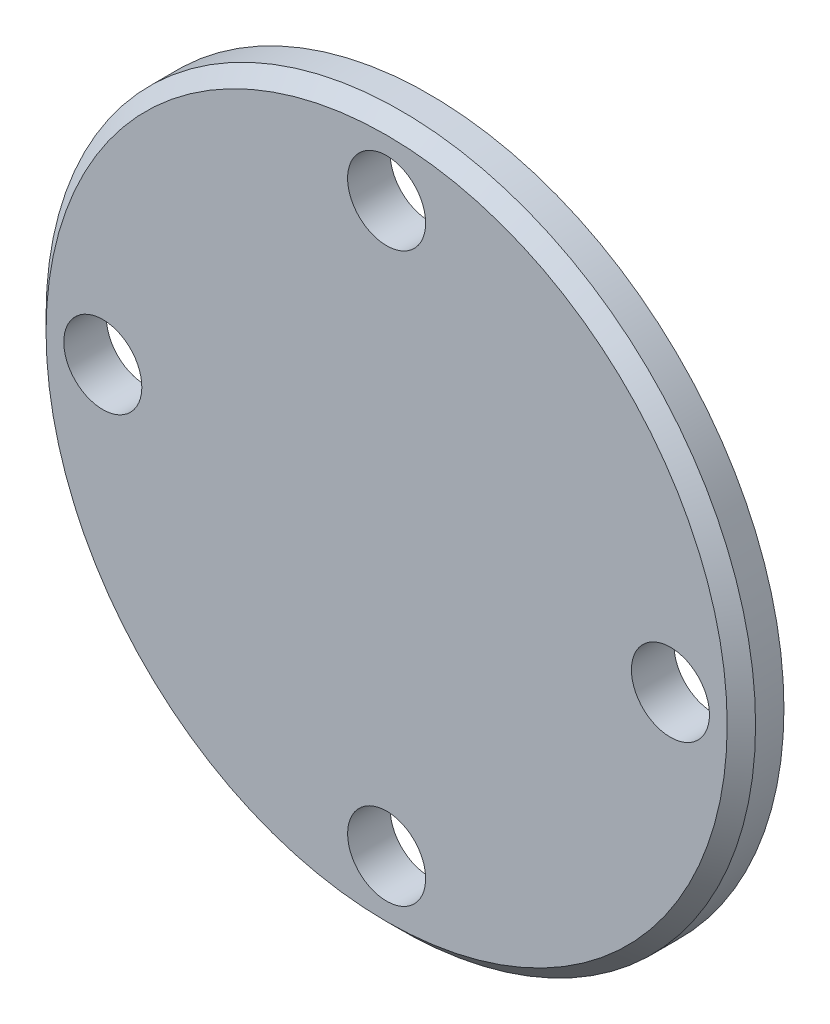
ISO-10303-21;
HEADER;
FILE_DESCRIPTION(('STEP AP214'),'2;1');
FILE_NAME('part.step','',(''),(''),'','','');
FILE_SCHEMA(('AUTOMOTIVE_DESIGN { 1 0 10303 214 1 1 1 1 }'));
ENDSEC;
DATA;
#1=APPLICATION_CONTEXT('core data for automotive mechanical design processes');
#2=APPLICATION_PROTOCOL_DEFINITION('international standard','automotive_design',2000,#1);
#3=PRODUCT_CONTEXT('',#1,'mechanical');
#4=PRODUCT('Part','Part','',(#3));
#5=PRODUCT_RELATED_PRODUCT_CATEGORY('part','',(#4));
#6=PRODUCT_DEFINITION_FORMATION('','',#4);
#7=PRODUCT_DEFINITION_CONTEXT('part definition',#1,'design');
#8=PRODUCT_DEFINITION('design','',#6,#7);
#9=PRODUCT_DEFINITION_SHAPE('','',#8);
#10=(LENGTH_UNIT() NAMED_UNIT(*) SI_UNIT(.MILLI.,.METRE.));
#11=(NAMED_UNIT(*) PLANE_ANGLE_UNIT() SI_UNIT($,.RADIAN.));
#12=(NAMED_UNIT(*) SI_UNIT($,.STERADIAN.) SOLID_ANGLE_UNIT());
#13=UNCERTAINTY_MEASURE_WITH_UNIT(LENGTH_MEASURE(1.E-05),#10,'distance_accuracy_value','');
#14=(GEOMETRIC_REPRESENTATION_CONTEXT(3) GLOBAL_UNCERTAINTY_ASSIGNED_CONTEXT((#13)) GLOBAL_UNIT_ASSIGNED_CONTEXT((#10,
#11,#12)) REPRESENTATION_CONTEXT('',''));
#15=CARTESIAN_POINT('',(0.,0.,0.));
#16=DIRECTION('',(0.,0.,1.));
#17=DIRECTION('',(1.,0.,0.));
#18=AXIS2_PLACEMENT_3D('',#15,#16,#17);
#19=CARTESIAN_POINT('',(0.,0.,3.));
#20=DIRECTION('',(0.,0.,-1.));
#21=DIRECTION('',(-1.,0.,0.));
#22=AXIS2_PLACEMENT_3D('',#19,#20,#21);
#23=CYLINDRICAL_SURFACE('',#22,25.);
#24=CARTESIAN_POINT('',(0.,0.,1.99999999999999));
#25=DIRECTION('',(0.,0.,1.));
#26=DIRECTION('',(1.,0.,0.));
#27=AXIS2_PLACEMENT_3D('',#24,#25,#26);
#28=CIRCLE('',#27,25.);
#29=CARTESIAN_POINT('',(25.,0.,1.99999999999999));
#30=VERTEX_POINT('',#29);
#31=EDGE_CURVE('E10',#30,#30,#28,.F.);
#32=ORIENTED_EDGE('',*,*,#31,.T.);
#33=EDGE_LOOP('',(#32));
#34=FACE_BOUND('',#33,.T.);
#35=CARTESIAN_POINT('',(0.,0.,0.));
#36=DIRECTION('',(0.,0.,1.));
#37=DIRECTION('',(1.,0.,0.));
#38=AXIS2_PLACEMENT_3D('',#35,#36,#37);
#39=CIRCLE('',#38,25.);
#40=CARTESIAN_POINT('',(25.,0.,0.));
#41=VERTEX_POINT('',#40);
#42=EDGE_CURVE('E59',#41,#41,#39,.T.);
#43=ORIENTED_EDGE('',*,*,#42,.T.);
#44=EDGE_LOOP('',(#43));
#45=FACE_BOUND('',#44,.T.);
#46=ADVANCED_FACE('F45',(#34,#45),#23,.T.);
#47=CARTESIAN_POINT('',(0.,0.,3.));
#48=DIRECTION('',(0.,0.,1.));
#49=DIRECTION('',(1.,0.,0.));
#50=AXIS2_PLACEMENT_3D('',#47,#48,#49);
#51=PLANE('',#50);
#52=CARTESIAN_POINT('',(-20.,0.,3.));
#53=DIRECTION('',(0.,0.,1.));
#54=DIRECTION('',(0.,1.,0.));
#55=AXIS2_PLACEMENT_3D('',#52,#53,#54);
#56=CIRCLE('',#55,2.75);
#57=CARTESIAN_POINT('',(-20.,2.74999999999993,3.));
#58=VERTEX_POINT('',#57);
#59=EDGE_CURVE('E91',#58,#58,#56,.T.);
#60=ORIENTED_EDGE('',*,*,#59,.F.);
#61=EDGE_LOOP('',(#60));
#62=FACE_BOUND('',#61,.T.);
#63=CARTESIAN_POINT('',(0.,-20.,3.));
#64=DIRECTION('',(0.,0.,1.));
#65=DIRECTION('',(-1.,0.,0.));
#66=AXIS2_PLACEMENT_3D('',#63,#64,#65);
#67=CIRCLE('',#66,2.75);
#68=CARTESIAN_POINT('',(-2.75,-20.,3.));
#69=VERTEX_POINT('',#68);
#70=EDGE_CURVE('E83',#69,#69,#67,.T.);
#71=ORIENTED_EDGE('',*,*,#70,.F.);
#72=EDGE_LOOP('',(#71));
#73=FACE_BOUND('',#72,.T.);
#74=CARTESIAN_POINT('',(20.,2.09488880330588E-13,3.));
#75=DIRECTION('',(0.,0.,1.));
#76=DIRECTION('',(0.,-1.,0.));
#77=AXIS2_PLACEMENT_3D('',#74,#75,#76);
#78=CIRCLE('',#77,2.75);
#79=CARTESIAN_POINT('',(20.,-2.74999999999979,3.));
#80=VERTEX_POINT('',#79);
#81=EDGE_CURVE('E75',#80,#80,#78,.T.);
#82=ORIENTED_EDGE('',*,*,#81,.F.);
#83=EDGE_LOOP('',(#82));
#84=FACE_BOUND('',#83,.T.);
#85=CARTESIAN_POINT('',(0.,20.,3.));
#86=DIRECTION('',(0.,0.,1.));
#87=DIRECTION('',(1.,0.,0.));
#88=AXIS2_PLACEMENT_3D('',#85,#86,#87);
#89=CIRCLE('',#88,2.75);
#90=CARTESIAN_POINT('',(2.75,20.,3.));
#91=VERTEX_POINT('',#90);
#92=EDGE_CURVE('E67',#91,#91,#89,.T.);
#93=ORIENTED_EDGE('',*,*,#92,.F.);
#94=EDGE_LOOP('',(#93));
#95=FACE_BOUND('',#94,.T.);
#96=CARTESIAN_POINT('',(0.,0.,3.));
#97=DIRECTION('',(0.,0.,1.));
#98=DIRECTION('',(1.,0.,0.));
#99=AXIS2_PLACEMENT_3D('',#96,#97,#98);
#100=CIRCLE('',#99,24.);
#101=CARTESIAN_POINT('',(24.,0.,3.));
#102=VERTEX_POINT('',#101);
#103=EDGE_CURVE('E54',#102,#102,#100,.T.);
#104=ORIENTED_EDGE('',*,*,#103,.T.);
#105=EDGE_LOOP('',(#104));
#106=FACE_BOUND('',#105,.T.);
#107=ADVANCED_FACE('F109',(#62,#73,#84,#95,#106),#51,.T.);
#108=CARTESIAN_POINT('',(0.,0.,0.));
#109=DIRECTION('',(0.,0.,1.));
#110=DIRECTION('',(1.,0.,0.));
#111=AXIS2_PLACEMENT_3D('',#108,#109,#110);
#112=PLANE('',#111);
#113=CARTESIAN_POINT('',(-20.,0.,0.));
#114=DIRECTION('',(0.,0.,1.));
#115=DIRECTION('',(0.,1.,0.));
#116=AXIS2_PLACEMENT_3D('',#113,#114,#115);
#117=CIRCLE('',#116,2.75);
#118=CARTESIAN_POINT('',(-20.,2.74999999999993,0.));
#119=VERTEX_POINT('',#118);
#120=EDGE_CURVE('E71',#119,#119,#117,.T.);
#121=ORIENTED_EDGE('',*,*,#120,.T.);
#122=EDGE_LOOP('',(#121));
#123=FACE_BOUND('',#122,.T.);
#124=CARTESIAN_POINT('',(0.,-20.,0.));
#125=DIRECTION('',(0.,0.,1.));
#126=DIRECTION('',(-1.,0.,0.));
#127=AXIS2_PLACEMENT_3D('',#124,#125,#126);
#128=CIRCLE('',#127,2.75);
#129=CARTESIAN_POINT('',(-2.75,-20.,0.));
#130=VERTEX_POINT('',#129);
#131=EDGE_CURVE('E87',#130,#130,#128,.T.);
#132=ORIENTED_EDGE('',*,*,#131,.T.);
#133=EDGE_LOOP('',(#132));
#134=FACE_BOUND('',#133,.T.);
#135=CARTESIAN_POINT('',(20.,2.09488880330588E-13,0.));
#136=DIRECTION('',(0.,0.,1.));
#137=DIRECTION('',(0.,-1.,0.));
#138=AXIS2_PLACEMENT_3D('',#135,#136,#137);
#139=CIRCLE('',#138,2.75);
#140=CARTESIAN_POINT('',(20.,-2.74999999999979,0.));
#141=VERTEX_POINT('',#140);
#142=EDGE_CURVE('E79',#141,#141,#139,.T.);
#143=ORIENTED_EDGE('',*,*,#142,.T.);
#144=EDGE_LOOP('',(#143));
#145=FACE_BOUND('',#144,.T.);
#146=CARTESIAN_POINT('',(0.,20.,0.));
#147=DIRECTION('',(0.,0.,1.));
#148=DIRECTION('',(1.,0.,0.));
#149=AXIS2_PLACEMENT_3D('',#146,#147,#148);
#150=CIRCLE('',#149,2.75);
#151=CARTESIAN_POINT('',(2.75,20.,0.));
#152=VERTEX_POINT('',#151);
#153=EDGE_CURVE('E64',#152,#152,#150,.T.);
#154=ORIENTED_EDGE('',*,*,#153,.T.);
#155=EDGE_LOOP('',(#154));
#156=FACE_BOUND('',#155,.T.);
#157=ORIENTED_EDGE('',*,*,#42,.F.);
#158=EDGE_LOOP('',(#157));
#159=FACE_BOUND('',#158,.T.);
#160=ADVANCED_FACE('F99',(#123,#134,#145,#156,#159),#112,.F.);
#161=CARTESIAN_POINT('',(0.,0.,3.));
#162=DIRECTION('',(0.,0.,-1.));
#163=DIRECTION('',(-1.,0.,0.));
#164=AXIS2_PLACEMENT_3D('',#161,#162,#163);
#165=CONICAL_SURFACE('',#164,24.,0.78539816339744);
#166=ORIENTED_EDGE('',*,*,#31,.F.);
#167=EDGE_LOOP('',(#166));
#168=FACE_BOUND('',#167,.T.);
#169=ORIENTED_EDGE('',*,*,#103,.F.);
#170=EDGE_LOOP('',(#169));
#171=FACE_BOUND('',#170,.T.);
#172=ADVANCED_FACE('F48',(#168,#171),#165,.T.);
#173=CARTESIAN_POINT('',(0.,20.,0.));
#174=DIRECTION('',(0.,0.,1.));
#175=DIRECTION('',(1.,0.,0.));
#176=AXIS2_PLACEMENT_3D('',#173,#174,#175);
#177=CYLINDRICAL_SURFACE('',#176,2.75);
#178=ORIENTED_EDGE('',*,*,#153,.F.);
#179=EDGE_LOOP('',(#178));
#180=FACE_BOUND('',#179,.T.);
#181=ORIENTED_EDGE('',*,*,#92,.T.);
#182=EDGE_LOOP('',(#181));
#183=FACE_BOUND('',#182,.T.);
#184=ADVANCED_FACE('F119',(#180,#183),#177,.F.);
#185=CARTESIAN_POINT('',(20.,2.09488880330588E-13,0.));
#186=DIRECTION('',(0.,0.,1.));
#187=DIRECTION('',(1.,0.,0.));
#188=AXIS2_PLACEMENT_3D('',#185,#186,#187);
#189=CYLINDRICAL_SURFACE('',#188,2.75);
#190=ORIENTED_EDGE('',*,*,#142,.F.);
#191=EDGE_LOOP('',(#190));
#192=FACE_BOUND('',#191,.T.);
#193=ORIENTED_EDGE('',*,*,#81,.T.);
#194=EDGE_LOOP('',(#193));
#195=FACE_BOUND('',#194,.T.);
#196=ADVANCED_FACE('F121',(#192,#195),#189,.F.);
#197=CARTESIAN_POINT('',(0.,-20.,0.));
#198=DIRECTION('',(0.,0.,1.));
#199=DIRECTION('',(1.,0.,0.));
#200=AXIS2_PLACEMENT_3D('',#197,#198,#199);
#201=CYLINDRICAL_SURFACE('',#200,2.75);
#202=ORIENTED_EDGE('',*,*,#131,.F.);
#203=EDGE_LOOP('',(#202));
#204=FACE_BOUND('',#203,.T.);
#205=ORIENTED_EDGE('',*,*,#70,.T.);
#206=EDGE_LOOP('',(#205));
#207=FACE_BOUND('',#206,.T.);
#208=ADVANCED_FACE('F105',(#204,#207),#201,.F.);
#209=CARTESIAN_POINT('',(-20.,0.,0.));
#210=DIRECTION('',(0.,0.,1.));
#211=DIRECTION('',(1.,0.,0.));
#212=AXIS2_PLACEMENT_3D('',#209,#210,#211);
#213=CYLINDRICAL_SURFACE('',#212,2.75);
#214=ORIENTED_EDGE('',*,*,#120,.F.);
#215=EDGE_LOOP('',(#214));
#216=FACE_BOUND('',#215,.T.);
#217=ORIENTED_EDGE('',*,*,#59,.T.);
#218=EDGE_LOOP('',(#217));
#219=FACE_BOUND('',#218,.T.);
#220=ADVANCED_FACE('F102',(#216,#219),#213,.F.);
#221=CLOSED_SHELL('',(#46,#107,#160,#172,#184,#196,#208,#220));
#222=MANIFOLD_SOLID_BREP('B2',#221);
#223=ADVANCED_BREP_SHAPE_REPRESENTATION('',(#18,#222),#14);
#224=SHAPE_DEFINITION_REPRESENTATION(#9,#223);
ENDSEC;
END-ISO-10303-21;
